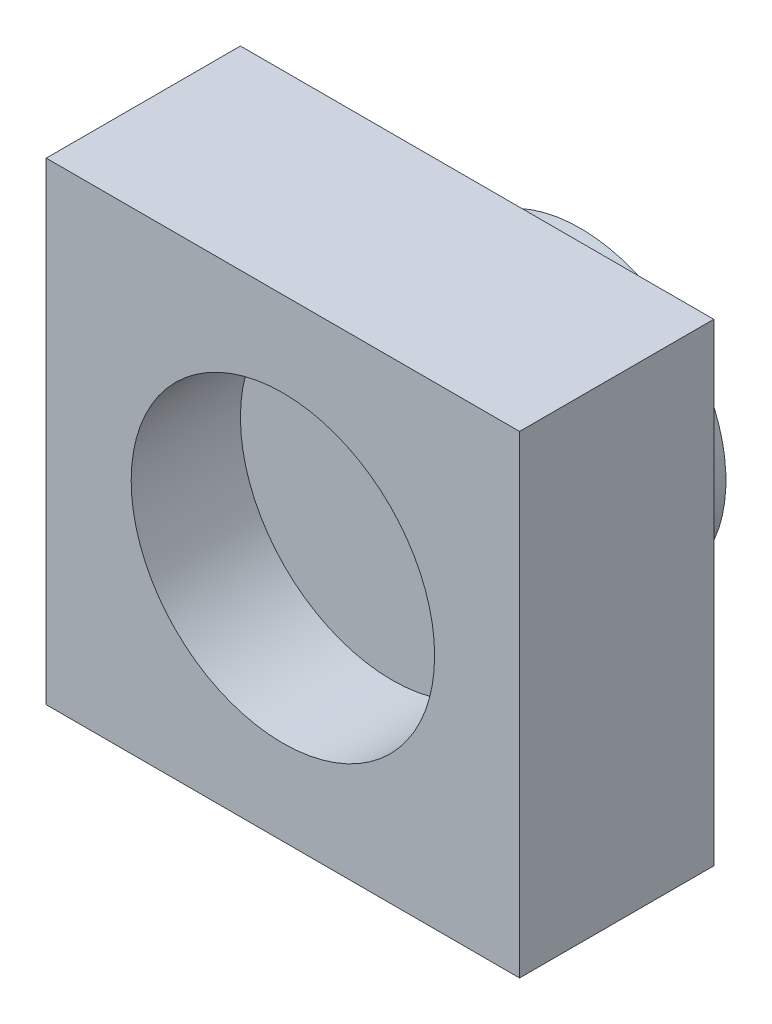
ISO-10303-21;
HEADER;
FILE_DESCRIPTION(('STEP AP214'),'2;1');
FILE_NAME('part.step','',(''),(''),'','','');
FILE_SCHEMA(('AUTOMOTIVE_DESIGN { 1 0 10303 214 1 1 1 1 }'));
ENDSEC;
DATA;
#1=APPLICATION_CONTEXT('core data for automotive mechanical design processes');
#2=APPLICATION_PROTOCOL_DEFINITION('international standard','automotive_design',2000,#1);
#3=PRODUCT_CONTEXT('',#1,'mechanical');
#4=PRODUCT('Part','Part','',(#3));
#5=PRODUCT_RELATED_PRODUCT_CATEGORY('part','',(#4));
#6=PRODUCT_DEFINITION_FORMATION('','',#4);
#7=PRODUCT_DEFINITION_CONTEXT('part definition',#1,'design');
#8=PRODUCT_DEFINITION('design','',#6,#7);
#9=PRODUCT_DEFINITION_SHAPE('','',#8);
#10=(LENGTH_UNIT() NAMED_UNIT(*) SI_UNIT(.MILLI.,.METRE.));
#11=(NAMED_UNIT(*) PLANE_ANGLE_UNIT() SI_UNIT($,.RADIAN.));
#12=(NAMED_UNIT(*) SI_UNIT($,.STERADIAN.) SOLID_ANGLE_UNIT());
#13=UNCERTAINTY_MEASURE_WITH_UNIT(LENGTH_MEASURE(1.E-05),#10,'distance_accuracy_value','');
#14=(GEOMETRIC_REPRESENTATION_CONTEXT(3) GLOBAL_UNCERTAINTY_ASSIGNED_CONTEXT((#13)) GLOBAL_UNIT_ASSIGNED_CONTEXT((#10,
#11,#12)) REPRESENTATION_CONTEXT('',''));
#15=CARTESIAN_POINT('',(0.,0.,0.));
#16=DIRECTION('',(0.,0.,1.));
#17=DIRECTION('',(1.,0.,0.));
#18=AXIS2_PLACEMENT_3D('',#15,#16,#17);
#19=CARTESIAN_POINT('',(0.,0.,0.));
#20=DIRECTION('',(0.,0.,-1.));
#21=DIRECTION('',(-1.,0.,0.));
#22=AXIS2_PLACEMENT_3D('',#19,#20,#21);
#23=PLANE('',#22);
#24=DIRECTION('',(0.,-1.,0.));
#25=VECTOR('',#24,1.);
#26=CARTESIAN_POINT('',(-3.9,3.9,0.));
#27=LINE('',#26,#25);
#28=CARTESIAN_POINT('',(-3.9,3.9,0.));
#29=VERTEX_POINT('',#28);
#30=CARTESIAN_POINT('',(-3.9,-3.9,0.));
#31=VERTEX_POINT('',#30);
#32=EDGE_CURVE('E99',#29,#31,#27,.T.);
#33=ORIENTED_EDGE('',*,*,#32,.F.);
#34=DIRECTION('',(-1.,0.,0.));
#35=VECTOR('',#34,1.);
#36=CARTESIAN_POINT('',(3.9,3.9,0.));
#37=LINE('',#36,#35);
#38=CARTESIAN_POINT('',(3.9,3.9,0.));
#39=VERTEX_POINT('',#38);
#40=EDGE_CURVE('E75',#39,#29,#37,.T.);
#41=ORIENTED_EDGE('',*,*,#40,.F.);
#42=DIRECTION('',(0.,1.,0.));
#43=VECTOR('',#42,1.);
#44=CARTESIAN_POINT('',(3.9,3.9,0.));
#45=LINE('',#44,#43);
#46=CARTESIAN_POINT('',(3.9,-3.9,0.));
#47=VERTEX_POINT('',#46);
#48=EDGE_CURVE('E69',#47,#39,#45,.T.);
#49=ORIENTED_EDGE('',*,*,#48,.F.);
#50=DIRECTION('',(1.,0.,0.));
#51=VECTOR('',#50,1.);
#52=CARTESIAN_POINT('',(3.9,-3.9,0.));
#53=LINE('',#52,#51);
#54=EDGE_CURVE('E91',#31,#47,#53,.T.);
#55=ORIENTED_EDGE('',*,*,#54,.F.);
#56=EDGE_LOOP('',(#33,#41,#49,#55));
#57=FACE_BOUND('',#56,.T.);
#58=CARTESIAN_POINT('',(0.,0.,0.));
#59=DIRECTION('',(0.,0.,-1.));
#60=DIRECTION('',(-1.,0.,0.));
#61=AXIS2_PLACEMENT_3D('',#58,#59,#60);
#62=CIRCLE('',#61,2.4);
#63=CARTESIAN_POINT('',(-2.4,0.,0.));
#64=VERTEX_POINT('',#63);
#65=EDGE_CURVE('E119',#64,#64,#62,.T.);
#66=ORIENTED_EDGE('',*,*,#65,.F.);
#67=EDGE_LOOP('',(#66));
#68=FACE_BOUND('',#67,.T.);
#69=ADVANCED_FACE('F35',(#57,#68),#23,.T.);
#70=CARTESIAN_POINT('',(-3.9,3.9,3.2));
#71=DIRECTION('',(1.,0.,0.));
#72=DIRECTION('',(0.,1.,0.));
#73=AXIS2_PLACEMENT_3D('',#70,#71,#72);
#74=PLANE('',#73);
#75=ORIENTED_EDGE('',*,*,#32,.T.);
#76=DIRECTION('',(0.,0.,-1.));
#77=VECTOR('',#76,1.);
#78=CARTESIAN_POINT('',(-3.9,-3.9,3.2));
#79=LINE('',#78,#77);
#80=CARTESIAN_POINT('',(-3.9,-3.9,3.2));
#81=VERTEX_POINT('',#80);
#82=EDGE_CURVE('E11',#81,#31,#79,.T.);
#83=ORIENTED_EDGE('',*,*,#82,.F.);
#84=DIRECTION('',(0.,-1.,0.));
#85=VECTOR('',#84,1.);
#86=CARTESIAN_POINT('',(-3.9,3.9,3.2));
#87=LINE('',#86,#85);
#88=CARTESIAN_POINT('',(-3.9,3.9,3.2));
#89=VERTEX_POINT('',#88);
#90=EDGE_CURVE('E87',#89,#81,#87,.T.);
#91=ORIENTED_EDGE('',*,*,#90,.F.);
#92=DIRECTION('',(0.,0.,-1.));
#93=VECTOR('',#92,1.);
#94=CARTESIAN_POINT('',(-3.9,3.9,3.2));
#95=LINE('',#94,#93);
#96=EDGE_CURVE('E95',#89,#29,#95,.T.);
#97=ORIENTED_EDGE('',*,*,#96,.T.);
#98=EDGE_LOOP('',(#75,#83,#91,#97));
#99=FACE_BOUND('',#98,.T.);
#100=ADVANCED_FACE('F37',(#99),#74,.F.);
#101=CARTESIAN_POINT('',(3.9,-3.9,3.2));
#102=DIRECTION('',(0.,1.,0.));
#103=DIRECTION('',(-1.,0.,0.));
#104=AXIS2_PLACEMENT_3D('',#101,#102,#103);
#105=PLANE('',#104);
#106=ORIENTED_EDGE('',*,*,#54,.T.);
#107=DIRECTION('',(0.,0.,-1.));
#108=VECTOR('',#107,1.);
#109=CARTESIAN_POINT('',(3.9,-3.9,3.2));
#110=LINE('',#109,#108);
#111=CARTESIAN_POINT('',(3.9,-3.9,3.2));
#112=VERTEX_POINT('',#111);
#113=EDGE_CURVE('E44',#112,#47,#110,.T.);
#114=ORIENTED_EDGE('',*,*,#113,.F.);
#115=DIRECTION('',(1.,0.,0.));
#116=VECTOR('',#115,1.);
#117=CARTESIAN_POINT('',(3.9,-3.9,3.2));
#118=LINE('',#117,#116);
#119=EDGE_CURVE('E82',#81,#112,#118,.T.);
#120=ORIENTED_EDGE('',*,*,#119,.F.);
#121=ORIENTED_EDGE('',*,*,#82,.T.);
#122=EDGE_LOOP('',(#106,#114,#120,#121));
#123=FACE_BOUND('',#122,.T.);
#124=ADVANCED_FACE('F90',(#123),#105,.F.);
#125=CARTESIAN_POINT('',(3.9,3.9,3.2));
#126=DIRECTION('',(-1.,0.,0.));
#127=DIRECTION('',(0.,-1.,0.));
#128=AXIS2_PLACEMENT_3D('',#125,#126,#127);
#129=PLANE('',#128);
#130=ORIENTED_EDGE('',*,*,#48,.T.);
#131=DIRECTION('',(0.,0.,-1.));
#132=VECTOR('',#131,1.);
#133=CARTESIAN_POINT('',(3.9,3.9,3.2));
#134=LINE('',#133,#132);
#135=CARTESIAN_POINT('',(3.9,3.9,3.2));
#136=VERTEX_POINT('',#135);
#137=EDGE_CURVE('E92',#136,#39,#134,.T.);
#138=ORIENTED_EDGE('',*,*,#137,.F.);
#139=DIRECTION('',(0.,1.,0.));
#140=VECTOR('',#139,1.);
#141=CARTESIAN_POINT('',(3.9,3.9,3.2));
#142=LINE('',#141,#140);
#143=EDGE_CURVE('E85',#112,#136,#142,.T.);
#144=ORIENTED_EDGE('',*,*,#143,.F.);
#145=ORIENTED_EDGE('',*,*,#113,.T.);
#146=EDGE_LOOP('',(#130,#138,#144,#145));
#147=FACE_BOUND('',#146,.T.);
#148=ADVANCED_FACE('F93',(#147),#129,.F.);
#149=CARTESIAN_POINT('',(3.9,3.9,3.2));
#150=DIRECTION('',(0.,-1.,0.));
#151=DIRECTION('',(1.,0.,0.));
#152=AXIS2_PLACEMENT_3D('',#149,#150,#151);
#153=PLANE('',#152);
#154=ORIENTED_EDGE('',*,*,#40,.T.);
#155=ORIENTED_EDGE('',*,*,#96,.F.);
#156=DIRECTION('',(-1.,0.,0.));
#157=VECTOR('',#156,1.);
#158=CARTESIAN_POINT('',(3.9,3.9,3.2));
#159=LINE('',#158,#157);
#160=EDGE_CURVE('E52',#136,#89,#159,.T.);
#161=ORIENTED_EDGE('',*,*,#160,.F.);
#162=ORIENTED_EDGE('',*,*,#137,.T.);
#163=EDGE_LOOP('',(#154,#155,#161,#162));
#164=FACE_BOUND('',#163,.T.);
#165=ADVANCED_FACE('F107',(#164),#153,.F.);
#166=CARTESIAN_POINT('',(0.,0.,3.2));
#167=DIRECTION('',(0.,0.,-1.));
#168=DIRECTION('',(-1.,0.,0.));
#169=AXIS2_PLACEMENT_3D('',#166,#167,#168);
#170=PLANE('',#169);
#171=CARTESIAN_POINT('',(0.,0.,3.2));
#172=DIRECTION('',(0.,0.,1.));
#173=DIRECTION('',(1.,0.,0.));
#174=AXIS2_PLACEMENT_3D('',#171,#172,#173);
#175=CIRCLE('',#174,2.5);
#176=CARTESIAN_POINT('',(2.5,0.,3.2));
#177=VERTEX_POINT('',#176);
#178=EDGE_CURVE('E113',#177,#177,#175,.T.);
#179=ORIENTED_EDGE('',*,*,#178,.F.);
#180=EDGE_LOOP('',(#179));
#181=FACE_BOUND('',#180,.T.);
#182=ORIENTED_EDGE('',*,*,#90,.T.);
#183=ORIENTED_EDGE('',*,*,#119,.T.);
#184=ORIENTED_EDGE('',*,*,#143,.T.);
#185=ORIENTED_EDGE('',*,*,#160,.T.);
#186=EDGE_LOOP('',(#182,#183,#184,#185));
#187=FACE_BOUND('',#186,.T.);
#188=ADVANCED_FACE('F83',(#181,#187),#170,.F.);
#189=CARTESIAN_POINT('',(0.,0.,1.4));
#190=DIRECTION('',(0.,0.,1.));
#191=DIRECTION('',(1.,0.,0.));
#192=AXIS2_PLACEMENT_3D('',#189,#190,#191);
#193=CYLINDRICAL_SURFACE('',#192,2.5);
#194=CARTESIAN_POINT('',(0.,0.,1.4));
#195=DIRECTION('',(0.,0.,1.));
#196=DIRECTION('',(1.,0.,0.));
#197=AXIS2_PLACEMENT_3D('',#194,#195,#196);
#198=CIRCLE('',#197,2.5);
#199=CARTESIAN_POINT('',(2.5,0.,1.4));
#200=VERTEX_POINT('',#199);
#201=EDGE_CURVE('E102',#200,#200,#198,.T.);
#202=ORIENTED_EDGE('',*,*,#201,.F.);
#203=EDGE_LOOP('',(#202));
#204=FACE_BOUND('',#203,.T.);
#205=ORIENTED_EDGE('',*,*,#178,.T.);
#206=EDGE_LOOP('',(#205));
#207=FACE_BOUND('',#206,.T.);
#208=ADVANCED_FACE('F165',(#204,#207),#193,.F.);
#209=CARTESIAN_POINT('',(0.,0.,1.4));
#210=DIRECTION('',(0.,0.,1.));
#211=DIRECTION('',(1.,0.,0.));
#212=AXIS2_PLACEMENT_3D('',#209,#210,#211);
#213=PLANE('',#212);
#214=ORIENTED_EDGE('',*,*,#201,.T.);
#215=EDGE_LOOP('',(#214));
#216=FACE_BOUND('',#215,.T.);
#217=ADVANCED_FACE('F130',(#216),#213,.T.);
#218=CARTESIAN_POINT('',(0.,0.,-1.7));
#219=DIRECTION('',(0.,0.,1.));
#220=DIRECTION('',(1.,0.,0.));
#221=AXIS2_PLACEMENT_3D('',#218,#219,#220);
#222=CYLINDRICAL_SURFACE('',#221,2.4);
#223=CARTESIAN_POINT('',(0.,0.,-1.7));
#224=DIRECTION('',(0.,0.,-1.));
#225=DIRECTION('',(-1.,0.,0.));
#226=AXIS2_PLACEMENT_3D('',#223,#224,#225);
#227=CIRCLE('',#226,2.4);
#228=CARTESIAN_POINT('',(-2.4,0.,-1.7));
#229=VERTEX_POINT('',#228);
#230=EDGE_CURVE('E116',#229,#229,#227,.T.);
#231=ORIENTED_EDGE('',*,*,#230,.F.);
#232=EDGE_LOOP('',(#231));
#233=FACE_BOUND('',#232,.T.);
#234=ORIENTED_EDGE('',*,*,#65,.T.);
#235=EDGE_LOOP('',(#234));
#236=FACE_BOUND('',#235,.T.);
#237=ADVANCED_FACE('F127',(#233,#236),#222,.T.);
#238=CARTESIAN_POINT('',(0.,0.,-1.7));
#239=DIRECTION('',(0.,0.,-1.));
#240=DIRECTION('',(-1.,0.,0.));
#241=AXIS2_PLACEMENT_3D('',#238,#239,#240);
#242=PLANE('',#241);
#243=ORIENTED_EDGE('',*,*,#230,.T.);
#244=EDGE_LOOP('',(#243));
#245=FACE_BOUND('',#244,.T.);
#246=ADVANCED_FACE('F125',(#245),#242,.T.);
#247=CLOSED_SHELL('',(#69,#100,#124,#148,#165,#188,#208,#217,#237,#246));
#248=MANIFOLD_SOLID_BREP('B2',#247);
#249=ADVANCED_BREP_SHAPE_REPRESENTATION('',(#18,#248),#14);
#250=SHAPE_DEFINITION_REPRESENTATION(#9,#249);
ENDSEC;
END-ISO-10303-21;
